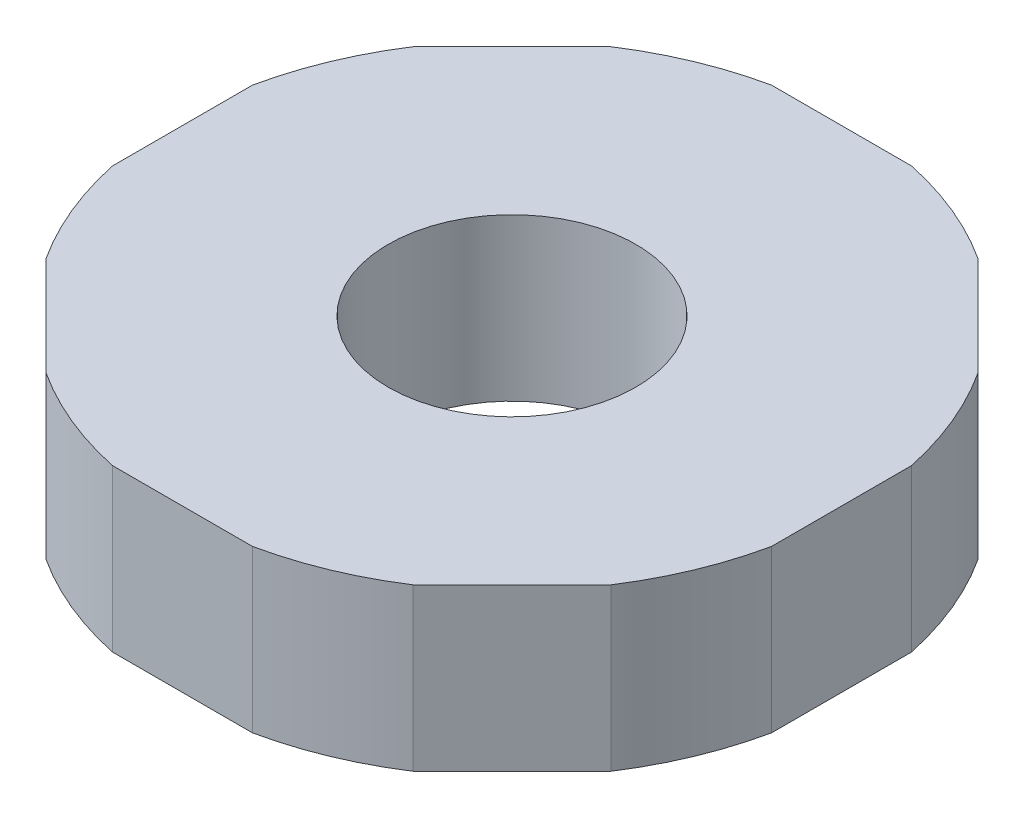
ISO-10303-21;
HEADER;
FILE_DESCRIPTION(('STEP AP214'),'2;1');
FILE_NAME('part.step','',(''),(''),'','','');
FILE_SCHEMA(('AUTOMOTIVE_DESIGN { 1 0 10303 214 1 1 1 1 }'));
ENDSEC;
DATA;
#1=APPLICATION_CONTEXT('core data for automotive mechanical design processes');
#2=APPLICATION_PROTOCOL_DEFINITION('international standard','automotive_design',2000,#1);
#3=PRODUCT_CONTEXT('',#1,'mechanical');
#4=PRODUCT('Part','Part','',(#3));
#5=PRODUCT_RELATED_PRODUCT_CATEGORY('part','',(#4));
#6=PRODUCT_DEFINITION_FORMATION('','',#4);
#7=PRODUCT_DEFINITION_CONTEXT('part definition',#1,'design');
#8=PRODUCT_DEFINITION('design','',#6,#7);
#9=PRODUCT_DEFINITION_SHAPE('','',#8);
#10=(LENGTH_UNIT() NAMED_UNIT(*) SI_UNIT(.MILLI.,.METRE.));
#11=(NAMED_UNIT(*) PLANE_ANGLE_UNIT() SI_UNIT($,.RADIAN.));
#12=(NAMED_UNIT(*) SI_UNIT($,.STERADIAN.) SOLID_ANGLE_UNIT());
#13=UNCERTAINTY_MEASURE_WITH_UNIT(LENGTH_MEASURE(1.E-05),#10,'distance_accuracy_value','');
#14=(GEOMETRIC_REPRESENTATION_CONTEXT(3) GLOBAL_UNCERTAINTY_ASSIGNED_CONTEXT((#13)) GLOBAL_UNIT_ASSIGNED_CONTEXT((#10,
#11,#12)) REPRESENTATION_CONTEXT('',''));
#15=CARTESIAN_POINT('',(0.,0.,0.));
#16=DIRECTION('',(0.,0.,1.));
#17=DIRECTION('',(1.,0.,0.));
#18=AXIS2_PLACEMENT_3D('',#15,#16,#17);
#19=CARTESIAN_POINT('',(0.,-3.,0.));
#20=DIRECTION('',(0.,1.,0.));
#21=DIRECTION('',(0.,0.,1.));
#22=AXIS2_PLACEMENT_3D('',#19,#20,#21);
#23=CYLINDRICAL_SURFACE('',#22,6.2578401025016);
#24=CARTESIAN_POINT('',(0.,0.,0.));
#25=DIRECTION('',(0.,1.,0.));
#26=DIRECTION('',(0.,0.,1.));
#27=AXIS2_PLACEMENT_3D('',#24,#25,#26);
#28=CIRCLE('',#27,6.2578401025016);
#29=CARTESIAN_POINT('',(1.29999999999999,0.,6.12132034355965));
#30=VERTEX_POINT('',#29);
#31=CARTESIAN_POINT('',(3.40918830920368,0.,5.24766594028871));
#32=VERTEX_POINT('',#31);
#33=EDGE_CURVE('E178',#30,#32,#28,.T.);
#34=ORIENTED_EDGE('',*,*,#33,.F.);
#35=DIRECTION('',(0.,1.,0.));
#36=VECTOR('',#35,1.);
#37=CARTESIAN_POINT('',(1.29999999999999,-3.,6.12132034355965));
#38=LINE('',#37,#36);
#39=CARTESIAN_POINT('',(1.29999999999999,-3.,6.12132034355965));
#40=VERTEX_POINT('',#39);
#41=EDGE_CURVE('E11',#40,#30,#38,.T.);
#42=ORIENTED_EDGE('',*,*,#41,.F.);
#43=CARTESIAN_POINT('',(0.,-3.,0.));
#44=DIRECTION('',(0.,1.,0.));
#45=DIRECTION('',(0.,0.,1.));
#46=AXIS2_PLACEMENT_3D('',#43,#44,#45);
#47=CIRCLE('',#46,6.2578401025016);
#48=CARTESIAN_POINT('',(3.40918830920368,-3.,5.24766594028871));
#49=VERTEX_POINT('',#48);
#50=EDGE_CURVE('E223',#40,#49,#47,.T.);
#51=ORIENTED_EDGE('',*,*,#50,.T.);
#52=DIRECTION('',(0.,1.,0.));
#53=VECTOR('',#52,1.);
#54=CARTESIAN_POINT('',(3.40918830920368,-3.,5.24766594028871));
#55=LINE('',#54,#53);
#56=EDGE_CURVE('E36',#49,#32,#55,.T.);
#57=ORIENTED_EDGE('',*,*,#56,.T.);
#58=EDGE_LOOP('',(#34,#42,#51,#57));
#59=FACE_BOUND('',#58,.T.);
#60=ADVANCED_FACE('F33',(#59),#23,.T.);
#61=CARTESIAN_POINT('',(-1.29999999999999,-3.,6.12132034355965));
#62=DIRECTION('',(0.,0.,1.));
#63=DIRECTION('',(1.,0.,0.));
#64=AXIS2_PLACEMENT_3D('',#61,#62,#63);
#65=PLANE('',#64);
#66=DIRECTION('',(1.,0.,0.));
#67=VECTOR('',#66,1.);
#68=CARTESIAN_POINT('',(-1.29999999999999,0.,6.12132034355965));
#69=LINE('',#68,#67);
#70=CARTESIAN_POINT('',(-1.29999999999999,0.,6.12132034355965));
#71=VERTEX_POINT('',#70);
#72=EDGE_CURVE('E221',#71,#30,#69,.T.);
#73=ORIENTED_EDGE('',*,*,#72,.F.);
#74=DIRECTION('',(0.,1.,0.));
#75=VECTOR('',#74,1.);
#76=CARTESIAN_POINT('',(-1.29999999999999,-3.,6.12132034355965));
#77=LINE('',#76,#75);
#78=CARTESIAN_POINT('',(-1.29999999999999,-3.,6.12132034355965));
#79=VERTEX_POINT('',#78);
#80=EDGE_CURVE('E42',#79,#71,#77,.T.);
#81=ORIENTED_EDGE('',*,*,#80,.F.);
#82=DIRECTION('',(1.,0.,0.));
#83=VECTOR('',#82,1.);
#84=CARTESIAN_POINT('',(-1.29999999999999,-3.,6.12132034355965));
#85=LINE('',#84,#83);
#86=EDGE_CURVE('E168',#79,#40,#85,.T.);
#87=ORIENTED_EDGE('',*,*,#86,.T.);
#88=ORIENTED_EDGE('',*,*,#41,.T.);
#89=EDGE_LOOP('',(#73,#81,#87,#88));
#90=FACE_BOUND('',#89,.T.);
#91=ADVANCED_FACE('F251',(#90),#65,.T.);
#92=CARTESIAN_POINT('',(0.,-3.,0.));
#93=DIRECTION('',(0.,1.,0.));
#94=DIRECTION('',(0.,0.,1.));
#95=AXIS2_PLACEMENT_3D('',#92,#93,#94);
#96=CYLINDRICAL_SURFACE('',#95,6.2578401025016);
#97=CARTESIAN_POINT('',(0.,0.,0.));
#98=DIRECTION('',(0.,1.,0.));
#99=DIRECTION('',(0.,0.,1.));
#100=AXIS2_PLACEMENT_3D('',#97,#98,#99);
#101=CIRCLE('',#100,6.2578401025016);
#102=CARTESIAN_POINT('',(-3.40918830920369,0.,5.2476659402887));
#103=VERTEX_POINT('',#102);
#104=EDGE_CURVE('E155',#103,#71,#101,.T.);
#105=ORIENTED_EDGE('',*,*,#104,.F.);
#106=DIRECTION('',(0.,1.,0.));
#107=VECTOR('',#106,1.);
#108=CARTESIAN_POINT('',(-3.40918830920369,-3.,5.2476659402887));
#109=LINE('',#108,#107);
#110=CARTESIAN_POINT('',(-3.40918830920369,-3.,5.2476659402887));
#111=VERTEX_POINT('',#110);
#112=EDGE_CURVE('E150',#111,#103,#109,.T.);
#113=ORIENTED_EDGE('',*,*,#112,.F.);
#114=CARTESIAN_POINT('',(0.,-3.,0.));
#115=DIRECTION('',(0.,1.,0.));
#116=DIRECTION('',(0.,0.,1.));
#117=AXIS2_PLACEMENT_3D('',#114,#115,#116);
#118=CIRCLE('',#117,6.2578401025016);
#119=EDGE_CURVE('E153',#111,#79,#118,.T.);
#120=ORIENTED_EDGE('',*,*,#119,.T.);
#121=ORIENTED_EDGE('',*,*,#80,.T.);
#122=EDGE_LOOP('',(#105,#113,#120,#121));
#123=FACE_BOUND('',#122,.T.);
#124=ADVANCED_FACE('F152',(#123),#96,.T.);
#125=CARTESIAN_POINT('',(-5.2476659402887,-3.,3.40918830920369));
#126=DIRECTION('',(-0.707106781186547,0.,0.707106781186548));
#127=DIRECTION('',(0.707106781186548,0.,0.707106781186547));
#128=AXIS2_PLACEMENT_3D('',#125,#126,#127);
#129=PLANE('',#128);
#130=DIRECTION('',(0.707106781186548,0.,0.707106781186547));
#131=VECTOR('',#130,1.);
#132=CARTESIAN_POINT('',(-5.2476659402887,0.,3.40918830920369));
#133=LINE('',#132,#131);
#134=CARTESIAN_POINT('',(-5.2476659402887,0.,3.40918830920369));
#135=VERTEX_POINT('',#134);
#136=EDGE_CURVE('E218',#135,#103,#133,.T.);
#137=ORIENTED_EDGE('',*,*,#136,.F.);
#138=DIRECTION('',(0.,1.,0.));
#139=VECTOR('',#138,1.);
#140=CARTESIAN_POINT('',(-5.2476659402887,-3.,3.40918830920369));
#141=LINE('',#140,#139);
#142=CARTESIAN_POINT('',(-5.2476659402887,-3.,3.40918830920369));
#143=VERTEX_POINT('',#142);
#144=EDGE_CURVE('E160',#143,#135,#141,.T.);
#145=ORIENTED_EDGE('',*,*,#144,.F.);
#146=DIRECTION('',(0.707106781186548,0.,0.707106781186547));
#147=VECTOR('',#146,1.);
#148=CARTESIAN_POINT('',(-5.2476659402887,-3.,3.40918830920369));
#149=LINE('',#148,#147);
#150=EDGE_CURVE('E166',#143,#111,#149,.T.);
#151=ORIENTED_EDGE('',*,*,#150,.T.);
#152=ORIENTED_EDGE('',*,*,#112,.T.);
#153=EDGE_LOOP('',(#137,#145,#151,#152));
#154=FACE_BOUND('',#153,.T.);
#155=ADVANCED_FACE('F170',(#154),#129,.T.);
#156=CARTESIAN_POINT('',(0.,-3.,0.));
#157=DIRECTION('',(0.,1.,0.));
#158=DIRECTION('',(0.,0.,1.));
#159=AXIS2_PLACEMENT_3D('',#156,#157,#158);
#160=CYLINDRICAL_SURFACE('',#159,6.2578401025016);
#161=CARTESIAN_POINT('',(0.,0.,0.));
#162=DIRECTION('',(0.,1.,0.));
#163=DIRECTION('',(0.,0.,1.));
#164=AXIS2_PLACEMENT_3D('',#161,#162,#163);
#165=CIRCLE('',#164,6.2578401025016);
#166=CARTESIAN_POINT('',(-6.12132034355965,0.,1.29999999999999));
#167=VERTEX_POINT('',#166);
#168=EDGE_CURVE('E215',#167,#135,#165,.T.);
#169=ORIENTED_EDGE('',*,*,#168,.F.);
#170=DIRECTION('',(0.,1.,0.));
#171=VECTOR('',#170,1.);
#172=CARTESIAN_POINT('',(-6.12132034355965,-3.,1.29999999999999));
#173=LINE('',#172,#171);
#174=CARTESIAN_POINT('',(-6.12132034355965,-3.,1.29999999999999));
#175=VERTEX_POINT('',#174);
#176=EDGE_CURVE('E227',#175,#167,#173,.T.);
#177=ORIENTED_EDGE('',*,*,#176,.F.);
#178=CARTESIAN_POINT('',(0.,-3.,0.));
#179=DIRECTION('',(0.,1.,0.));
#180=DIRECTION('',(0.,0.,1.));
#181=AXIS2_PLACEMENT_3D('',#178,#179,#180);
#182=CIRCLE('',#181,6.2578401025016);
#183=EDGE_CURVE('E171',#175,#143,#182,.T.);
#184=ORIENTED_EDGE('',*,*,#183,.T.);
#185=ORIENTED_EDGE('',*,*,#144,.T.);
#186=EDGE_LOOP('',(#169,#177,#184,#185));
#187=FACE_BOUND('',#186,.T.);
#188=ADVANCED_FACE('F264',(#187),#160,.T.);
#189=CARTESIAN_POINT('',(-6.12132034355965,-3.,-1.29999999999999));
#190=DIRECTION('',(-1.,0.,0.));
#191=DIRECTION('',(0.,0.,1.));
#192=AXIS2_PLACEMENT_3D('',#189,#190,#191);
#193=PLANE('',#192);
#194=DIRECTION('',(0.,0.,1.));
#195=VECTOR('',#194,1.);
#196=CARTESIAN_POINT('',(-6.12132034355965,0.,-1.29999999999999));
#197=LINE('',#196,#195);
#198=CARTESIAN_POINT('',(-6.12132034355965,0.,-1.29999999999999));
#199=VERTEX_POINT('',#198);
#200=EDGE_CURVE('E212',#199,#167,#197,.T.);
#201=ORIENTED_EDGE('',*,*,#200,.F.);
#202=DIRECTION('',(0.,1.,0.));
#203=VECTOR('',#202,1.);
#204=CARTESIAN_POINT('',(-6.12132034355965,-3.,-1.29999999999999));
#205=LINE('',#204,#203);
#206=CARTESIAN_POINT('',(-6.12132034355965,-3.,-1.29999999999999));
#207=VERTEX_POINT('',#206);
#208=EDGE_CURVE('E229',#207,#199,#205,.T.);
#209=ORIENTED_EDGE('',*,*,#208,.F.);
#210=DIRECTION('',(0.,0.,1.));
#211=VECTOR('',#210,1.);
#212=CARTESIAN_POINT('',(-6.12132034355965,-3.,-1.29999999999999));
#213=LINE('',#212,#211);
#214=EDGE_CURVE('E173',#207,#175,#213,.T.);
#215=ORIENTED_EDGE('',*,*,#214,.T.);
#216=ORIENTED_EDGE('',*,*,#176,.T.);
#217=EDGE_LOOP('',(#201,#209,#215,#216));
#218=FACE_BOUND('',#217,.T.);
#219=ADVANCED_FACE('F267',(#218),#193,.T.);
#220=CARTESIAN_POINT('',(0.,-3.,0.));
#221=DIRECTION('',(0.,1.,0.));
#222=DIRECTION('',(0.,0.,1.));
#223=AXIS2_PLACEMENT_3D('',#220,#221,#222);
#224=CYLINDRICAL_SURFACE('',#223,6.2578401025016);
#225=CARTESIAN_POINT('',(0.,0.,0.));
#226=DIRECTION('',(0.,1.,0.));
#227=DIRECTION('',(0.,0.,1.));
#228=AXIS2_PLACEMENT_3D('',#225,#226,#227);
#229=CIRCLE('',#228,6.2578401025016);
#230=CARTESIAN_POINT('',(-5.2476659402887,0.,-3.40918830920369));
#231=VERTEX_POINT('',#230);
#232=EDGE_CURVE('E209',#231,#199,#229,.T.);
#233=ORIENTED_EDGE('',*,*,#232,.F.);
#234=DIRECTION('',(0.,1.,0.));
#235=VECTOR('',#234,1.);
#236=CARTESIAN_POINT('',(-5.2476659402887,-3.,-3.40918830920369));
#237=LINE('',#236,#235);
#238=CARTESIAN_POINT('',(-5.2476659402887,-3.,-3.40918830920369));
#239=VERTEX_POINT('',#238);
#240=EDGE_CURVE('E231',#239,#231,#237,.T.);
#241=ORIENTED_EDGE('',*,*,#240,.F.);
#242=CARTESIAN_POINT('',(0.,-3.,0.));
#243=DIRECTION('',(0.,1.,0.));
#244=DIRECTION('',(0.,0.,1.));
#245=AXIS2_PLACEMENT_3D('',#242,#243,#244);
#246=CIRCLE('',#245,6.2578401025016);
#247=EDGE_CURVE('E358',#239,#207,#246,.T.);
#248=ORIENTED_EDGE('',*,*,#247,.T.);
#249=ORIENTED_EDGE('',*,*,#208,.T.);
#250=EDGE_LOOP('',(#233,#241,#248,#249));
#251=FACE_BOUND('',#250,.T.);
#252=ADVANCED_FACE('F271',(#251),#224,.T.);
#253=CARTESIAN_POINT('',(-3.40918830920368,-3.,-5.2476659402887));
#254=DIRECTION('',(-0.707106781186547,0.,-0.707106781186547));
#255=DIRECTION('',(-0.707106781186548,0.,0.707106781186548));
#256=AXIS2_PLACEMENT_3D('',#253,#254,#255);
#257=PLANE('',#256);
#258=DIRECTION('',(-0.707106781186548,0.,0.707106781186548));
#259=VECTOR('',#258,1.);
#260=CARTESIAN_POINT('',(-3.40918830920368,0.,-5.2476659402887));
#261=LINE('',#260,#259);
#262=CARTESIAN_POINT('',(-3.40918830920368,0.,-5.2476659402887));
#263=VERTEX_POINT('',#262);
#264=EDGE_CURVE('E206',#263,#231,#261,.T.);
#265=ORIENTED_EDGE('',*,*,#264,.F.);
#266=DIRECTION('',(0.,1.,0.));
#267=VECTOR('',#266,1.);
#268=CARTESIAN_POINT('',(-3.40918830920368,-3.,-5.2476659402887));
#269=LINE('',#268,#267);
#270=CARTESIAN_POINT('',(-3.40918830920368,-3.,-5.2476659402887));
#271=VERTEX_POINT('',#270);
#272=EDGE_CURVE('E233',#271,#263,#269,.T.);
#273=ORIENTED_EDGE('',*,*,#272,.F.);
#274=DIRECTION('',(-0.707106781186548,0.,0.707106781186548));
#275=VECTOR('',#274,1.);
#276=CARTESIAN_POINT('',(-3.40918830920368,-3.,-5.2476659402887));
#277=LINE('',#276,#275);
#278=EDGE_CURVE('E355',#271,#239,#277,.T.);
#279=ORIENTED_EDGE('',*,*,#278,.T.);
#280=ORIENTED_EDGE('',*,*,#240,.T.);
#281=EDGE_LOOP('',(#265,#273,#279,#280));
#282=FACE_BOUND('',#281,.T.);
#283=ADVANCED_FACE('F275',(#282),#257,.T.);
#284=CARTESIAN_POINT('',(0.,-3.,0.));
#285=DIRECTION('',(0.,1.,0.));
#286=DIRECTION('',(0.,0.,1.));
#287=AXIS2_PLACEMENT_3D('',#284,#285,#286);
#288=CYLINDRICAL_SURFACE('',#287,6.2578401025016);
#289=CARTESIAN_POINT('',(0.,0.,0.));
#290=DIRECTION('',(0.,1.,0.));
#291=DIRECTION('',(0.,0.,1.));
#292=AXIS2_PLACEMENT_3D('',#289,#290,#291);
#293=CIRCLE('',#292,6.2578401025016);
#294=CARTESIAN_POINT('',(-1.3,0.,-6.12132034355965));
#295=VERTEX_POINT('',#294);
#296=EDGE_CURVE('E203',#295,#263,#293,.T.);
#297=ORIENTED_EDGE('',*,*,#296,.F.);
#298=DIRECTION('',(0.,1.,0.));
#299=VECTOR('',#298,1.);
#300=CARTESIAN_POINT('',(-1.3,-3.,-6.12132034355965));
#301=LINE('',#300,#299);
#302=CARTESIAN_POINT('',(-1.3,-3.,-6.12132034355965));
#303=VERTEX_POINT('',#302);
#304=EDGE_CURVE('E235',#303,#295,#301,.T.);
#305=ORIENTED_EDGE('',*,*,#304,.F.);
#306=CARTESIAN_POINT('',(0.,-3.,0.));
#307=DIRECTION('',(0.,1.,0.));
#308=DIRECTION('',(0.,0.,1.));
#309=AXIS2_PLACEMENT_3D('',#306,#307,#308);
#310=CIRCLE('',#309,6.2578401025016);
#311=EDGE_CURVE('E352',#303,#271,#310,.T.);
#312=ORIENTED_EDGE('',*,*,#311,.T.);
#313=ORIENTED_EDGE('',*,*,#272,.T.);
#314=EDGE_LOOP('',(#297,#305,#312,#313));
#315=FACE_BOUND('',#314,.T.);
#316=ADVANCED_FACE('F279',(#315),#288,.T.);
#317=CARTESIAN_POINT('',(1.3,-3.,-6.12132034355965));
#318=DIRECTION('',(0.,0.,-1.));
#319=DIRECTION('',(-1.,0.,0.));
#320=AXIS2_PLACEMENT_3D('',#317,#318,#319);
#321=PLANE('',#320);
#322=DIRECTION('',(-1.,0.,0.));
#323=VECTOR('',#322,1.);
#324=CARTESIAN_POINT('',(1.3,0.,-6.12132034355965));
#325=LINE('',#324,#323);
#326=CARTESIAN_POINT('',(1.3,0.,-6.12132034355965));
#327=VERTEX_POINT('',#326);
#328=EDGE_CURVE('E200',#327,#295,#325,.T.);
#329=ORIENTED_EDGE('',*,*,#328,.F.);
#330=DIRECTION('',(0.,1.,0.));
#331=VECTOR('',#330,1.);
#332=CARTESIAN_POINT('',(1.3,-3.,-6.12132034355965));
#333=LINE('',#332,#331);
#334=CARTESIAN_POINT('',(1.3,-3.,-6.12132034355965));
#335=VERTEX_POINT('',#334);
#336=EDGE_CURVE('E237',#335,#327,#333,.T.);
#337=ORIENTED_EDGE('',*,*,#336,.F.);
#338=DIRECTION('',(-1.,0.,0.));
#339=VECTOR('',#338,1.);
#340=CARTESIAN_POINT('',(1.3,-3.,-6.12132034355965));
#341=LINE('',#340,#339);
#342=EDGE_CURVE('E349',#335,#303,#341,.T.);
#343=ORIENTED_EDGE('',*,*,#342,.T.);
#344=ORIENTED_EDGE('',*,*,#304,.T.);
#345=EDGE_LOOP('',(#329,#337,#343,#344));
#346=FACE_BOUND('',#345,.T.);
#347=ADVANCED_FACE('F283',(#346),#321,.T.);
#348=CARTESIAN_POINT('',(0.,-3.,0.));
#349=DIRECTION('',(0.,1.,0.));
#350=DIRECTION('',(0.,0.,1.));
#351=AXIS2_PLACEMENT_3D('',#348,#349,#350);
#352=CYLINDRICAL_SURFACE('',#351,6.2578401025016);
#353=CARTESIAN_POINT('',(0.,0.,0.));
#354=DIRECTION('',(0.,1.,0.));
#355=DIRECTION('',(0.,0.,1.));
#356=AXIS2_PLACEMENT_3D('',#353,#354,#355);
#357=CIRCLE('',#356,6.2578401025016);
#358=CARTESIAN_POINT('',(3.40918830920368,0.,-5.24766594028871));
#359=VERTEX_POINT('',#358);
#360=EDGE_CURVE('E197',#359,#327,#357,.T.);
#361=ORIENTED_EDGE('',*,*,#360,.F.);
#362=DIRECTION('',(0.,1.,0.));
#363=VECTOR('',#362,1.);
#364=CARTESIAN_POINT('',(3.40918830920368,-3.,-5.24766594028871));
#365=LINE('',#364,#363);
#366=CARTESIAN_POINT('',(3.40918830920368,-3.,-5.24766594028871));
#367=VERTEX_POINT('',#366);
#368=EDGE_CURVE('E239',#367,#359,#365,.T.);
#369=ORIENTED_EDGE('',*,*,#368,.F.);
#370=CARTESIAN_POINT('',(0.,-3.,0.));
#371=DIRECTION('',(0.,1.,0.));
#372=DIRECTION('',(0.,0.,1.));
#373=AXIS2_PLACEMENT_3D('',#370,#371,#372);
#374=CIRCLE('',#373,6.2578401025016);
#375=EDGE_CURVE('E346',#367,#335,#374,.T.);
#376=ORIENTED_EDGE('',*,*,#375,.T.);
#377=ORIENTED_EDGE('',*,*,#336,.T.);
#378=EDGE_LOOP('',(#361,#369,#376,#377));
#379=FACE_BOUND('',#378,.T.);
#380=ADVANCED_FACE('F287',(#379),#352,.T.);
#381=CARTESIAN_POINT('',(5.24766594028871,-3.,-3.40918830920368));
#382=DIRECTION('',(0.707106781186547,0.,-0.707106781186548));
#383=DIRECTION('',(-0.707106781186548,0.,-0.707106781186547));
#384=AXIS2_PLACEMENT_3D('',#381,#382,#383);
#385=PLANE('',#384);
#386=DIRECTION('',(-0.707106781186548,0.,-0.707106781186547));
#387=VECTOR('',#386,1.);
#388=CARTESIAN_POINT('',(5.24766594028871,0.,-3.40918830920368));
#389=LINE('',#388,#387);
#390=CARTESIAN_POINT('',(5.24766594028871,0.,-3.40918830920368));
#391=VERTEX_POINT('',#390);
#392=EDGE_CURVE('E194',#391,#359,#389,.T.);
#393=ORIENTED_EDGE('',*,*,#392,.F.);
#394=DIRECTION('',(0.,1.,0.));
#395=VECTOR('',#394,1.);
#396=CARTESIAN_POINT('',(5.24766594028871,-3.,-3.40918830920368));
#397=LINE('',#396,#395);
#398=CARTESIAN_POINT('',(5.24766594028871,-3.,-3.40918830920368));
#399=VERTEX_POINT('',#398);
#400=EDGE_CURVE('E241',#399,#391,#397,.T.);
#401=ORIENTED_EDGE('',*,*,#400,.F.);
#402=DIRECTION('',(-0.707106781186548,0.,-0.707106781186547));
#403=VECTOR('',#402,1.);
#404=CARTESIAN_POINT('',(5.24766594028871,-3.,-3.40918830920368));
#405=LINE('',#404,#403);
#406=EDGE_CURVE('E343',#399,#367,#405,.T.);
#407=ORIENTED_EDGE('',*,*,#406,.T.);
#408=ORIENTED_EDGE('',*,*,#368,.T.);
#409=EDGE_LOOP('',(#393,#401,#407,#408));
#410=FACE_BOUND('',#409,.T.);
#411=ADVANCED_FACE('F291',(#410),#385,.T.);
#412=CARTESIAN_POINT('',(0.,-3.,0.));
#413=DIRECTION('',(0.,1.,0.));
#414=DIRECTION('',(0.,0.,1.));
#415=AXIS2_PLACEMENT_3D('',#412,#413,#414);
#416=CYLINDRICAL_SURFACE('',#415,6.2578401025016);
#417=CARTESIAN_POINT('',(0.,0.,0.));
#418=DIRECTION('',(0.,1.,0.));
#419=DIRECTION('',(0.,0.,1.));
#420=AXIS2_PLACEMENT_3D('',#417,#418,#419);
#421=CIRCLE('',#420,6.2578401025016);
#422=CARTESIAN_POINT('',(6.12132034355965,0.,-1.3));
#423=VERTEX_POINT('',#422);
#424=EDGE_CURVE('E191',#423,#391,#421,.T.);
#425=ORIENTED_EDGE('',*,*,#424,.F.);
#426=DIRECTION('',(0.,1.,0.));
#427=VECTOR('',#426,1.);
#428=CARTESIAN_POINT('',(6.12132034355965,-3.,-1.3));
#429=LINE('',#428,#427);
#430=CARTESIAN_POINT('',(6.12132034355965,-3.,-1.3));
#431=VERTEX_POINT('',#430);
#432=EDGE_CURVE('E243',#431,#423,#429,.T.);
#433=ORIENTED_EDGE('',*,*,#432,.F.);
#434=CARTESIAN_POINT('',(0.,-3.,0.));
#435=DIRECTION('',(0.,1.,0.));
#436=DIRECTION('',(0.,0.,1.));
#437=AXIS2_PLACEMENT_3D('',#434,#435,#436);
#438=CIRCLE('',#437,6.2578401025016);
#439=EDGE_CURVE('E340',#431,#399,#438,.T.);
#440=ORIENTED_EDGE('',*,*,#439,.T.);
#441=ORIENTED_EDGE('',*,*,#400,.T.);
#442=EDGE_LOOP('',(#425,#433,#440,#441));
#443=FACE_BOUND('',#442,.T.);
#444=ADVANCED_FACE('F295',(#443),#416,.T.);
#445=CARTESIAN_POINT('',(6.12132034355965,-3.,1.3));
#446=DIRECTION('',(1.,0.,0.));
#447=DIRECTION('',(0.,0.,-1.));
#448=AXIS2_PLACEMENT_3D('',#445,#446,#447);
#449=PLANE('',#448);
#450=DIRECTION('',(0.,0.,-1.));
#451=VECTOR('',#450,1.);
#452=CARTESIAN_POINT('',(6.12132034355965,0.,1.3));
#453=LINE('',#452,#451);
#454=CARTESIAN_POINT('',(6.12132034355965,0.,1.3));
#455=VERTEX_POINT('',#454);
#456=EDGE_CURVE('E188',#455,#423,#453,.T.);
#457=ORIENTED_EDGE('',*,*,#456,.F.);
#458=DIRECTION('',(0.,1.,0.));
#459=VECTOR('',#458,1.);
#460=CARTESIAN_POINT('',(6.12132034355965,-3.,1.3));
#461=LINE('',#460,#459);
#462=CARTESIAN_POINT('',(6.12132034355965,-3.,1.3));
#463=VERTEX_POINT('',#462);
#464=EDGE_CURVE('E245',#463,#455,#461,.T.);
#465=ORIENTED_EDGE('',*,*,#464,.F.);
#466=DIRECTION('',(0.,0.,-1.));
#467=VECTOR('',#466,1.);
#468=CARTESIAN_POINT('',(6.12132034355965,-3.,1.3));
#469=LINE('',#468,#467);
#470=EDGE_CURVE('E337',#463,#431,#469,.T.);
#471=ORIENTED_EDGE('',*,*,#470,.T.);
#472=ORIENTED_EDGE('',*,*,#432,.T.);
#473=EDGE_LOOP('',(#457,#465,#471,#472));
#474=FACE_BOUND('',#473,.T.);
#475=ADVANCED_FACE('F299',(#474),#449,.T.);
#476=CARTESIAN_POINT('',(0.,-3.,0.));
#477=DIRECTION('',(0.,1.,0.));
#478=DIRECTION('',(0.,0.,1.));
#479=AXIS2_PLACEMENT_3D('',#476,#477,#478);
#480=CYLINDRICAL_SURFACE('',#479,6.2578401025016);
#481=CARTESIAN_POINT('',(0.,0.,0.));
#482=DIRECTION('',(0.,1.,0.));
#483=DIRECTION('',(0.,0.,1.));
#484=AXIS2_PLACEMENT_3D('',#481,#482,#483);
#485=CIRCLE('',#484,6.2578401025016);
#486=CARTESIAN_POINT('',(5.24766594028871,0.,3.40918830920368));
#487=VERTEX_POINT('',#486);
#488=EDGE_CURVE('E185',#487,#455,#485,.T.);
#489=ORIENTED_EDGE('',*,*,#488,.F.);
#490=DIRECTION('',(0.,1.,0.));
#491=VECTOR('',#490,1.);
#492=CARTESIAN_POINT('',(5.24766594028871,-3.,3.40918830920368));
#493=LINE('',#492,#491);
#494=CARTESIAN_POINT('',(5.24766594028871,-3.,3.40918830920368));
#495=VERTEX_POINT('',#494);
#496=EDGE_CURVE('E246',#495,#487,#493,.T.);
#497=ORIENTED_EDGE('',*,*,#496,.F.);
#498=CARTESIAN_POINT('',(0.,-3.,0.));
#499=DIRECTION('',(0.,1.,0.));
#500=DIRECTION('',(0.,0.,1.));
#501=AXIS2_PLACEMENT_3D('',#498,#499,#500);
#502=CIRCLE('',#501,6.2578401025016);
#503=EDGE_CURVE('E334',#495,#463,#502,.T.);
#504=ORIENTED_EDGE('',*,*,#503,.T.);
#505=ORIENTED_EDGE('',*,*,#464,.T.);
#506=EDGE_LOOP('',(#489,#497,#504,#505));
#507=FACE_BOUND('',#506,.T.);
#508=ADVANCED_FACE('F303',(#507),#480,.T.);
#509=CARTESIAN_POINT('',(3.40918830920368,-3.,5.24766594028871));
#510=DIRECTION('',(0.707106781186547,0.,0.707106781186548));
#511=DIRECTION('',(0.707106781186548,0.,-0.707106781186547));
#512=AXIS2_PLACEMENT_3D('',#509,#510,#511);
#513=PLANE('',#512);
#514=DIRECTION('',(0.707106781186548,0.,-0.707106781186547));
#515=VECTOR('',#514,1.);
#516=CARTESIAN_POINT('',(3.40918830920368,0.,5.24766594028871));
#517=LINE('',#516,#515);
#518=EDGE_CURVE('E181',#32,#487,#517,.T.);
#519=ORIENTED_EDGE('',*,*,#518,.F.);
#520=ORIENTED_EDGE('',*,*,#56,.F.);
#521=DIRECTION('',(0.707106781186548,0.,-0.707106781186547));
#522=VECTOR('',#521,1.);
#523=CARTESIAN_POINT('',(3.40918830920368,-3.,5.24766594028871));
#524=LINE('',#523,#522);
#525=EDGE_CURVE('E332',#49,#495,#524,.T.);
#526=ORIENTED_EDGE('',*,*,#525,.T.);
#527=ORIENTED_EDGE('',*,*,#496,.T.);
#528=EDGE_LOOP('',(#519,#520,#526,#527));
#529=FACE_BOUND('',#528,.T.);
#530=ADVANCED_FACE('F248',(#529),#513,.T.);
#531=CARTESIAN_POINT('',(0.,-3.,0.));
#532=DIRECTION('',(0.,1.,0.));
#533=DIRECTION('',(0.,0.,1.));
#534=AXIS2_PLACEMENT_3D('',#531,#532,#533);
#535=PLANE('',#534);
#536=CARTESIAN_POINT('',(0.,-3.,0.));
#537=DIRECTION('',(0.,1.,0.));
#538=DIRECTION('',(0.,0.,1.));
#539=AXIS2_PLACEMENT_3D('',#536,#537,#538);
#540=CIRCLE('',#539,2.3);
#541=CARTESIAN_POINT('',(0.,-3.,2.3));
#542=VERTEX_POINT('',#541);
#543=EDGE_CURVE('E182',#542,#542,#540,.T.);
#544=ORIENTED_EDGE('',*,*,#543,.T.);
#545=EDGE_LOOP('',(#544));
#546=FACE_BOUND('',#545,.T.);
#547=ORIENTED_EDGE('',*,*,#50,.F.);
#548=ORIENTED_EDGE('',*,*,#86,.F.);
#549=ORIENTED_EDGE('',*,*,#119,.F.);
#550=ORIENTED_EDGE('',*,*,#150,.F.);
#551=ORIENTED_EDGE('',*,*,#183,.F.);
#552=ORIENTED_EDGE('',*,*,#214,.F.);
#553=ORIENTED_EDGE('',*,*,#247,.F.);
#554=ORIENTED_EDGE('',*,*,#278,.F.);
#555=ORIENTED_EDGE('',*,*,#311,.F.);
#556=ORIENTED_EDGE('',*,*,#342,.F.);
#557=ORIENTED_EDGE('',*,*,#375,.F.);
#558=ORIENTED_EDGE('',*,*,#406,.F.);
#559=ORIENTED_EDGE('',*,*,#439,.F.);
#560=ORIENTED_EDGE('',*,*,#470,.F.);
#561=ORIENTED_EDGE('',*,*,#503,.F.);
#562=ORIENTED_EDGE('',*,*,#525,.F.);
#563=EDGE_LOOP('',(#547,#548,#549,#550,#551,#552,#553,#554,#555,#556,#557,#558,#559,#560,#561,#562));
#564=FACE_BOUND('',#563,.T.);
#565=ADVANCED_FACE('F164',(#546,#564),#535,.F.);
#566=CARTESIAN_POINT('',(0.,0.,0.));
#567=DIRECTION('',(0.,1.,0.));
#568=DIRECTION('',(0.,0.,1.));
#569=AXIS2_PLACEMENT_3D('',#566,#567,#568);
#570=PLANE('',#569);
#571=CARTESIAN_POINT('',(0.,0.,0.));
#572=DIRECTION('',(0.,1.,0.));
#573=DIRECTION('',(0.,0.,1.));
#574=AXIS2_PLACEMENT_3D('',#571,#572,#573);
#575=CIRCLE('',#574,2.3);
#576=CARTESIAN_POINT('',(0.,0.,2.3));
#577=VERTEX_POINT('',#576);
#578=EDGE_CURVE('E327',#577,#577,#575,.T.);
#579=ORIENTED_EDGE('',*,*,#578,.F.);
#580=EDGE_LOOP('',(#579));
#581=FACE_BOUND('',#580,.T.);
#582=ORIENTED_EDGE('',*,*,#33,.T.);
#583=ORIENTED_EDGE('',*,*,#518,.T.);
#584=ORIENTED_EDGE('',*,*,#488,.T.);
#585=ORIENTED_EDGE('',*,*,#456,.T.);
#586=ORIENTED_EDGE('',*,*,#424,.T.);
#587=ORIENTED_EDGE('',*,*,#392,.T.);
#588=ORIENTED_EDGE('',*,*,#360,.T.);
#589=ORIENTED_EDGE('',*,*,#328,.T.);
#590=ORIENTED_EDGE('',*,*,#296,.T.);
#591=ORIENTED_EDGE('',*,*,#264,.T.);
#592=ORIENTED_EDGE('',*,*,#232,.T.);
#593=ORIENTED_EDGE('',*,*,#200,.T.);
#594=ORIENTED_EDGE('',*,*,#168,.T.);
#595=ORIENTED_EDGE('',*,*,#136,.T.);
#596=ORIENTED_EDGE('',*,*,#104,.T.);
#597=ORIENTED_EDGE('',*,*,#72,.T.);
#598=EDGE_LOOP('',(#582,#583,#584,#585,#586,#587,#588,#589,#590,#591,#592,#593,#594,#595,#596,#597));
#599=FACE_BOUND('',#598,.T.);
#600=ADVANCED_FACE('F250',(#581,#599),#570,.T.);
#601=CARTESIAN_POINT('',(0.,-3.,0.));
#602=DIRECTION('',(0.,1.,0.));
#603=DIRECTION('',(0.,0.,1.));
#604=AXIS2_PLACEMENT_3D('',#601,#602,#603);
#605=CYLINDRICAL_SURFACE('',#604,2.3);
#606=ORIENTED_EDGE('',*,*,#543,.F.);
#607=EDGE_LOOP('',(#606));
#608=FACE_BOUND('',#607,.T.);
#609=ORIENTED_EDGE('',*,*,#578,.T.);
#610=EDGE_LOOP('',(#609));
#611=FACE_BOUND('',#610,.T.);
#612=ADVANCED_FACE('F315',(#608,#611),#605,.F.);
#613=CLOSED_SHELL('',(#60,#91,#124,#155,#188,#219,#252,#283,#316,#347,#380,#411,#444,#475,#508,
#530,#565,#600,#612));
#614=MANIFOLD_SOLID_BREP('B2',#613);
#615=ADVANCED_BREP_SHAPE_REPRESENTATION('',(#18,#614),#14);
#616=SHAPE_DEFINITION_REPRESENTATION(#9,#615);
ENDSEC;
END-ISO-10303-21;
